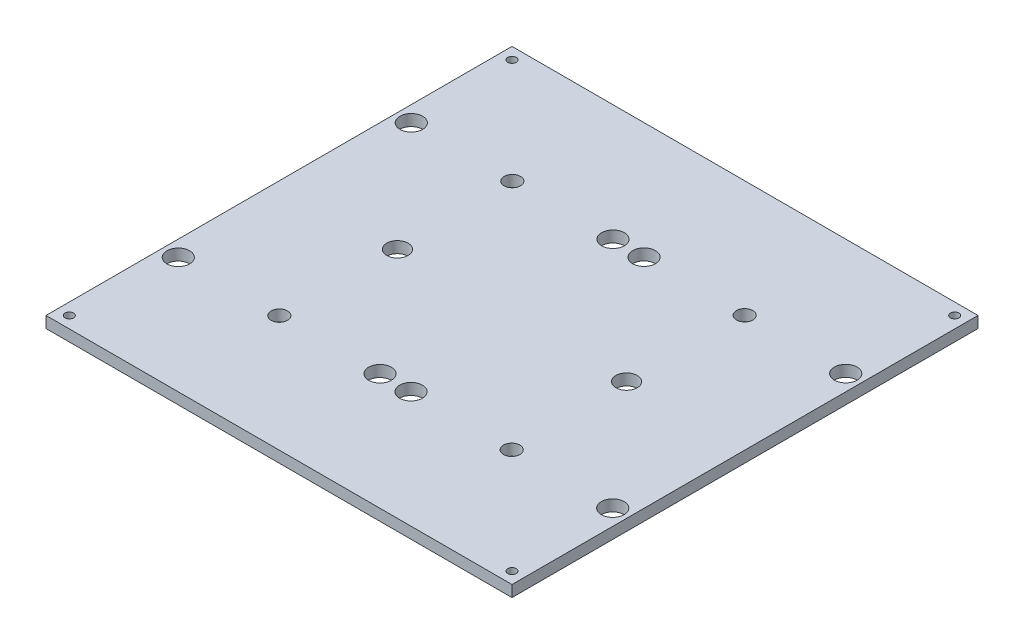
ISO-10303-21;
HEADER;
FILE_DESCRIPTION(('STEP AP214'),'2;1');
FILE_NAME('part.step','',(''),(''),'','','');
FILE_SCHEMA(('AUTOMOTIVE_DESIGN { 1 0 10303 214 1 1 1 1 }'));
ENDSEC;
DATA;
#1=APPLICATION_CONTEXT('core data for automotive mechanical design processes');
#2=APPLICATION_PROTOCOL_DEFINITION('international standard','automotive_design',2000,#1);
#3=PRODUCT_CONTEXT('',#1,'mechanical');
#4=PRODUCT('Part','Part','',(#3));
#5=PRODUCT_RELATED_PRODUCT_CATEGORY('part','',(#4));
#6=PRODUCT_DEFINITION_FORMATION('','',#4);
#7=PRODUCT_DEFINITION_CONTEXT('part definition',#1,'design');
#8=PRODUCT_DEFINITION('design','',#6,#7);
#9=PRODUCT_DEFINITION_SHAPE('','',#8);
#10=(LENGTH_UNIT() NAMED_UNIT(*) SI_UNIT(.MILLI.,.METRE.));
#11=(NAMED_UNIT(*) PLANE_ANGLE_UNIT() SI_UNIT($,.RADIAN.));
#12=(NAMED_UNIT(*) SI_UNIT($,.STERADIAN.) SOLID_ANGLE_UNIT());
#13=UNCERTAINTY_MEASURE_WITH_UNIT(LENGTH_MEASURE(1.E-05),#10,'distance_accuracy_value','');
#14=(GEOMETRIC_REPRESENTATION_CONTEXT(3) GLOBAL_UNCERTAINTY_ASSIGNED_CONTEXT((#13)) GLOBAL_UNIT_ASSIGNED_CONTEXT((#10,
#11,#12)) REPRESENTATION_CONTEXT('',''));
#15=CARTESIAN_POINT('',(0.,0.,0.));
#16=DIRECTION('',(0.,0.,1.));
#17=DIRECTION('',(1.,0.,0.));
#18=AXIS2_PLACEMENT_3D('',#15,#16,#17);
#19=CARTESIAN_POINT('',(0.,1.46,0.));
#20=DIRECTION('',(0.,-1.,0.));
#21=DIRECTION('',(0.,0.,-1.));
#22=AXIS2_PLACEMENT_3D('',#19,#20,#21);
#23=PLANE('',#22);
#24=DIRECTION('',(0.,0.,1.));
#25=VECTOR('',#24,1.);
#26=CARTESIAN_POINT('',(-30.,1.46,-30.));
#27=LINE('',#26,#25);
#28=CARTESIAN_POINT('',(-30.,1.46,-30.));
#29=VERTEX_POINT('',#28);
#30=CARTESIAN_POINT('',(-30.,1.46,30.));
#31=VERTEX_POINT('',#30);
#32=EDGE_CURVE('E85',#29,#31,#27,.T.);
#33=ORIENTED_EDGE('',*,*,#32,.T.);
#34=DIRECTION('',(1.,0.,0.));
#35=VECTOR('',#34,1.);
#36=CARTESIAN_POINT('',(30.,1.46,30.));
#37=LINE('',#36,#35);
#38=CARTESIAN_POINT('',(30.,1.46,30.));
#39=VERTEX_POINT('',#38);
#40=EDGE_CURVE('E80',#31,#39,#37,.T.);
#41=ORIENTED_EDGE('',*,*,#40,.T.);
#42=DIRECTION('',(0.,0.,-1.));
#43=VECTOR('',#42,1.);
#44=CARTESIAN_POINT('',(30.,1.46,-30.));
#45=LINE('',#44,#43);
#46=CARTESIAN_POINT('',(30.,1.46,-30.));
#47=VERTEX_POINT('',#46);
#48=EDGE_CURVE('E83',#39,#47,#45,.T.);
#49=ORIENTED_EDGE('',*,*,#48,.T.);
#50=DIRECTION('',(-1.,0.,0.));
#51=VECTOR('',#50,1.);
#52=CARTESIAN_POINT('',(30.,1.46,-30.));
#53=LINE('',#52,#51);
#54=EDGE_CURVE('E50',#47,#29,#53,.T.);
#55=ORIENTED_EDGE('',*,*,#54,.T.);
#56=EDGE_LOOP('',(#33,#41,#49,#55));
#57=FACE_BOUND('',#56,.T.);
#58=CARTESIAN_POINT('',(-14.75,1.46,0.));
#59=DIRECTION('',(0.,1.,0.));
#60=DIRECTION('',(0.,0.,1.));
#61=AXIS2_PLACEMENT_3D('',#58,#59,#60);
#62=CIRCLE('',#61,1.375);
#63=CARTESIAN_POINT('',(-14.75,1.46,1.375));
#64=VERTEX_POINT('',#63);
#65=EDGE_CURVE('E100',#64,#64,#62,.T.);
#66=ORIENTED_EDGE('',*,*,#65,.F.);
#67=EDGE_LOOP('',(#66));
#68=FACE_BOUND('',#67,.T.);
#69=CARTESIAN_POINT('',(-28.5,1.46,-28.5));
#70=DIRECTION('',(0.,1.,0.));
#71=DIRECTION('',(0.,0.,1.));
#72=AXIS2_PLACEMENT_3D('',#69,#70,#71);
#73=CIRCLE('',#72,0.550000000000003);
#74=CARTESIAN_POINT('',(-28.5,1.46,-27.95));
#75=VERTEX_POINT('',#74);
#76=EDGE_CURVE('E115',#75,#75,#73,.T.);
#77=ORIENTED_EDGE('',*,*,#76,.F.);
#78=EDGE_LOOP('',(#77));
#79=FACE_BOUND('',#78,.T.);
#80=CARTESIAN_POINT('',(-27.968,1.46,-15.));
#81=DIRECTION('',(0.,1.,0.));
#82=DIRECTION('',(0.,0.,1.));
#83=AXIS2_PLACEMENT_3D('',#80,#81,#82);
#84=CIRCLE('',#83,1.465);
#85=CARTESIAN_POINT('',(-27.968,1.46,-13.535));
#86=VERTEX_POINT('',#85);
#87=EDGE_CURVE('E121',#86,#86,#84,.T.);
#88=ORIENTED_EDGE('',*,*,#87,.F.);
#89=EDGE_LOOP('',(#88));
#90=FACE_BOUND('',#89,.T.);
#91=CARTESIAN_POINT('',(2.,1.46,-15.));
#92=DIRECTION('',(0.,1.,0.));
#93=DIRECTION('',(0.,0.,-1.));
#94=AXIS2_PLACEMENT_3D('',#91,#92,#93);
#95=CIRCLE('',#94,1.465);
#96=CARTESIAN_POINT('',(2.,1.46,-16.465));
#97=VERTEX_POINT('',#96);
#98=EDGE_CURVE('E127',#97,#97,#95,.T.);
#99=ORIENTED_EDGE('',*,*,#98,.F.);
#100=EDGE_LOOP('',(#99));
#101=FACE_BOUND('',#100,.T.);
#102=CARTESIAN_POINT('',(-14.960000108,1.46,-15.));
#103=DIRECTION('',(0.,1.,0.));
#104=DIRECTION('',(0.,0.,1.));
#105=AXIS2_PLACEMENT_3D('',#102,#103,#104);
#106=CIRCLE('',#105,1.055);
#107=CARTESIAN_POINT('',(-14.960000108,1.46,-13.945));
#108=VERTEX_POINT('',#107);
#109=EDGE_CURVE('E133',#108,#108,#106,.T.);
#110=ORIENTED_EDGE('',*,*,#109,.F.);
#111=EDGE_LOOP('',(#110));
#112=FACE_BOUND('',#111,.T.);
#113=CARTESIAN_POINT('',(-2.,1.46,-15.));
#114=DIRECTION('',(0.,1.,0.));
#115=DIRECTION('',(0.,0.,1.));
#116=AXIS2_PLACEMENT_3D('',#113,#114,#115);
#117=CIRCLE('',#116,1.465);
#118=CARTESIAN_POINT('',(-2.,1.46,-13.535));
#119=VERTEX_POINT('',#118);
#120=EDGE_CURVE('E139',#119,#119,#117,.T.);
#121=ORIENTED_EDGE('',*,*,#120,.F.);
#122=EDGE_LOOP('',(#121));
#123=FACE_BOUND('',#122,.T.);
#124=CARTESIAN_POINT('',(14.960000108,1.46,-15.));
#125=DIRECTION('',(0.,1.,0.));
#126=DIRECTION('',(0.,0.,-1.));
#127=AXIS2_PLACEMENT_3D('',#124,#125,#126);
#128=CIRCLE('',#127,1.055);
#129=CARTESIAN_POINT('',(14.960000108,1.46,-16.055));
#130=VERTEX_POINT('',#129);
#131=EDGE_CURVE('E145',#130,#130,#128,.T.);
#132=ORIENTED_EDGE('',*,*,#131,.F.);
#133=EDGE_LOOP('',(#132));
#134=FACE_BOUND('',#133,.T.);
#135=CARTESIAN_POINT('',(14.75,1.46,0.));
#136=DIRECTION('',(0.,1.,0.));
#137=DIRECTION('',(0.,0.,-1.));
#138=AXIS2_PLACEMENT_3D('',#135,#136,#137);
#139=CIRCLE('',#138,1.375);
#140=CARTESIAN_POINT('',(14.75,1.46,-1.37500000000001));
#141=VERTEX_POINT('',#140);
#142=EDGE_CURVE('E151',#141,#141,#139,.T.);
#143=ORIENTED_EDGE('',*,*,#142,.F.);
#144=EDGE_LOOP('',(#143));
#145=FACE_BOUND('',#144,.T.);
#146=CARTESIAN_POINT('',(27.968,1.46,-15.));
#147=DIRECTION('',(0.,1.,0.));
#148=DIRECTION('',(0.,0.,-1.));
#149=AXIS2_PLACEMENT_3D('',#146,#147,#148);
#150=CIRCLE('',#149,1.465);
#151=CARTESIAN_POINT('',(27.968,1.46,-16.465));
#152=VERTEX_POINT('',#151);
#153=EDGE_CURVE('E157',#152,#152,#150,.T.);
#154=ORIENTED_EDGE('',*,*,#153,.F.);
#155=EDGE_LOOP('',(#154));
#156=FACE_BOUND('',#155,.T.);
#157=CARTESIAN_POINT('',(28.5,1.46,-28.5));
#158=DIRECTION('',(0.,1.,0.));
#159=DIRECTION('',(0.,0.,-1.));
#160=AXIS2_PLACEMENT_3D('',#157,#158,#159);
#161=CIRCLE('',#160,0.550000000000003);
#162=CARTESIAN_POINT('',(28.5,1.46,-29.05));
#163=VERTEX_POINT('',#162);
#164=EDGE_CURVE('E163',#163,#163,#161,.T.);
#165=ORIENTED_EDGE('',*,*,#164,.F.);
#166=EDGE_LOOP('',(#165));
#167=FACE_BOUND('',#166,.T.);
#168=CARTESIAN_POINT('',(28.5,1.46,28.5));
#169=DIRECTION('',(0.,1.,0.));
#170=DIRECTION('',(0.,0.,1.));
#171=AXIS2_PLACEMENT_3D('',#168,#169,#170);
#172=CIRCLE('',#171,0.550000000000003);
#173=CARTESIAN_POINT('',(28.5,1.46,29.05));
#174=VERTEX_POINT('',#173);
#175=EDGE_CURVE('E169',#174,#174,#172,.T.);
#176=ORIENTED_EDGE('',*,*,#175,.F.);
#177=EDGE_LOOP('',(#176));
#178=FACE_BOUND('',#177,.T.);
#179=CARTESIAN_POINT('',(27.968,1.46,15.));
#180=DIRECTION('',(0.,1.,0.));
#181=DIRECTION('',(0.,0.,1.));
#182=AXIS2_PLACEMENT_3D('',#179,#180,#181);
#183=CIRCLE('',#182,1.465);
#184=CARTESIAN_POINT('',(27.968,1.46,16.465));
#185=VERTEX_POINT('',#184);
#186=EDGE_CURVE('E175',#185,#185,#183,.T.);
#187=ORIENTED_EDGE('',*,*,#186,.F.);
#188=EDGE_LOOP('',(#187));
#189=FACE_BOUND('',#188,.T.);
#190=CARTESIAN_POINT('',(14.960000108,1.46,15.));
#191=DIRECTION('',(0.,1.,0.));
#192=DIRECTION('',(0.,0.,1.));
#193=AXIS2_PLACEMENT_3D('',#190,#191,#192);
#194=CIRCLE('',#193,1.055);
#195=CARTESIAN_POINT('',(14.960000108,1.46,16.055));
#196=VERTEX_POINT('',#195);
#197=EDGE_CURVE('E181',#196,#196,#194,.T.);
#198=ORIENTED_EDGE('',*,*,#197,.F.);
#199=EDGE_LOOP('',(#198));
#200=FACE_BOUND('',#199,.T.);
#201=CARTESIAN_POINT('',(1.99999999999997,1.46,15.));
#202=DIRECTION('',(0.,1.,0.));
#203=DIRECTION('',(0.,0.,1.));
#204=AXIS2_PLACEMENT_3D('',#201,#202,#203);
#205=CIRCLE('',#204,1.46499999999998);
#206=CARTESIAN_POINT('',(1.99999999999997,1.46,16.465));
#207=VERTEX_POINT('',#206);
#208=EDGE_CURVE('E187',#207,#207,#205,.T.);
#209=ORIENTED_EDGE('',*,*,#208,.F.);
#210=EDGE_LOOP('',(#209));
#211=FACE_BOUND('',#210,.T.);
#212=CARTESIAN_POINT('',(-2.00000000000002,1.46,15.));
#213=DIRECTION('',(0.,1.,0.));
#214=DIRECTION('',(0.,0.,-1.));
#215=AXIS2_PLACEMENT_3D('',#212,#213,#214);
#216=CIRCLE('',#215,1.46500000000001);
#217=CARTESIAN_POINT('',(-2.00000000000002,1.46,13.535));
#218=VERTEX_POINT('',#217);
#219=EDGE_CURVE('E193',#218,#218,#216,.T.);
#220=ORIENTED_EDGE('',*,*,#219,.F.);
#221=EDGE_LOOP('',(#220));
#222=FACE_BOUND('',#221,.T.);
#223=CARTESIAN_POINT('',(-14.960000108,1.46,15.));
#224=DIRECTION('',(0.,1.,0.));
#225=DIRECTION('',(0.,0.,-1.));
#226=AXIS2_PLACEMENT_3D('',#223,#224,#225);
#227=CIRCLE('',#226,1.055);
#228=CARTESIAN_POINT('',(-14.960000108,1.46,13.945));
#229=VERTEX_POINT('',#228);
#230=EDGE_CURVE('E199',#229,#229,#227,.T.);
#231=ORIENTED_EDGE('',*,*,#230,.F.);
#232=EDGE_LOOP('',(#231));
#233=FACE_BOUND('',#232,.T.);
#234=CARTESIAN_POINT('',(-27.968,1.46,15.));
#235=DIRECTION('',(0.,1.,0.));
#236=DIRECTION('',(0.,0.,-1.));
#237=AXIS2_PLACEMENT_3D('',#234,#235,#236);
#238=CIRCLE('',#237,1.465);
#239=CARTESIAN_POINT('',(-27.968,1.46,13.535));
#240=VERTEX_POINT('',#239);
#241=EDGE_CURVE('E205',#240,#240,#238,.T.);
#242=ORIENTED_EDGE('',*,*,#241,.F.);
#243=EDGE_LOOP('',(#242));
#244=FACE_BOUND('',#243,.T.);
#245=CARTESIAN_POINT('',(-28.5,1.46,28.5));
#246=DIRECTION('',(0.,1.,0.));
#247=DIRECTION('',(0.,0.,-1.));
#248=AXIS2_PLACEMENT_3D('',#245,#246,#247);
#249=CIRCLE('',#248,0.550000000000003);
#250=CARTESIAN_POINT('',(-28.5,1.46,27.95));
#251=VERTEX_POINT('',#250);
#252=EDGE_CURVE('E211',#251,#251,#249,.T.);
#253=ORIENTED_EDGE('',*,*,#252,.F.);
#254=EDGE_LOOP('',(#253));
#255=FACE_BOUND('',#254,.T.);
#256=ADVANCED_FACE('F33',(#57,#68,#79,#90,#101,#112,#123,#134,#145,#156,#167,#178,#189,#200,
#211,#222,#233,#244,#255),#23,.F.);
#257=CARTESIAN_POINT('',(0.,0.,0.));
#258=DIRECTION('',(0.,-1.,0.));
#259=DIRECTION('',(0.,0.,-1.));
#260=AXIS2_PLACEMENT_3D('',#257,#258,#259);
#261=PLANE('',#260);
#262=CARTESIAN_POINT('',(-27.968,0.,15.));
#263=DIRECTION('',(0.,1.,0.));
#264=DIRECTION('',(0.,0.,-1.));
#265=AXIS2_PLACEMENT_3D('',#262,#263,#264);
#266=CIRCLE('',#265,1.465);
#267=CARTESIAN_POINT('',(-27.968,0.,13.535));
#268=VERTEX_POINT('',#267);
#269=EDGE_CURVE('E208',#268,#268,#266,.T.);
#270=ORIENTED_EDGE('',*,*,#269,.T.);
#271=EDGE_LOOP('',(#270));
#272=FACE_BOUND('',#271,.T.);
#273=CARTESIAN_POINT('',(-2.00000000000002,0.,15.));
#274=DIRECTION('',(0.,1.,0.));
#275=DIRECTION('',(0.,0.,-1.));
#276=AXIS2_PLACEMENT_3D('',#273,#274,#275);
#277=CIRCLE('',#276,1.46500000000001);
#278=CARTESIAN_POINT('',(-2.00000000000002,0.,13.535));
#279=VERTEX_POINT('',#278);
#280=EDGE_CURVE('E196',#279,#279,#277,.T.);
#281=ORIENTED_EDGE('',*,*,#280,.T.);
#282=EDGE_LOOP('',(#281));
#283=FACE_BOUND('',#282,.T.);
#284=CARTESIAN_POINT('',(14.960000108,0.,15.));
#285=DIRECTION('',(0.,1.,0.));
#286=DIRECTION('',(0.,0.,1.));
#287=AXIS2_PLACEMENT_3D('',#284,#285,#286);
#288=CIRCLE('',#287,1.055);
#289=CARTESIAN_POINT('',(14.960000108,0.,16.055));
#290=VERTEX_POINT('',#289);
#291=EDGE_CURVE('E184',#290,#290,#288,.T.);
#292=ORIENTED_EDGE('',*,*,#291,.T.);
#293=EDGE_LOOP('',(#292));
#294=FACE_BOUND('',#293,.T.);
#295=CARTESIAN_POINT('',(28.5,0.,28.5));
#296=DIRECTION('',(0.,1.,0.));
#297=DIRECTION('',(0.,0.,1.));
#298=AXIS2_PLACEMENT_3D('',#295,#296,#297);
#299=CIRCLE('',#298,0.550000000000003);
#300=CARTESIAN_POINT('',(28.5,0.,29.05));
#301=VERTEX_POINT('',#300);
#302=EDGE_CURVE('E172',#301,#301,#299,.T.);
#303=ORIENTED_EDGE('',*,*,#302,.T.);
#304=EDGE_LOOP('',(#303));
#305=FACE_BOUND('',#304,.T.);
#306=CARTESIAN_POINT('',(27.968,0.,-15.));
#307=DIRECTION('',(0.,1.,0.));
#308=DIRECTION('',(0.,0.,-1.));
#309=AXIS2_PLACEMENT_3D('',#306,#307,#308);
#310=CIRCLE('',#309,1.465);
#311=CARTESIAN_POINT('',(27.968,0.,-16.465));
#312=VERTEX_POINT('',#311);
#313=EDGE_CURVE('E160',#312,#312,#310,.T.);
#314=ORIENTED_EDGE('',*,*,#313,.T.);
#315=EDGE_LOOP('',(#314));
#316=FACE_BOUND('',#315,.T.);
#317=CARTESIAN_POINT('',(14.960000108,0.,-15.));
#318=DIRECTION('',(0.,1.,0.));
#319=DIRECTION('',(0.,0.,-1.));
#320=AXIS2_PLACEMENT_3D('',#317,#318,#319);
#321=CIRCLE('',#320,1.055);
#322=CARTESIAN_POINT('',(14.960000108,0.,-16.055));
#323=VERTEX_POINT('',#322);
#324=EDGE_CURVE('E148',#323,#323,#321,.T.);
#325=ORIENTED_EDGE('',*,*,#324,.T.);
#326=EDGE_LOOP('',(#325));
#327=FACE_BOUND('',#326,.T.);
#328=CARTESIAN_POINT('',(-14.960000108,0.,-15.));
#329=DIRECTION('',(0.,1.,0.));
#330=DIRECTION('',(0.,0.,1.));
#331=AXIS2_PLACEMENT_3D('',#328,#329,#330);
#332=CIRCLE('',#331,1.055);
#333=CARTESIAN_POINT('',(-14.960000108,0.,-13.945));
#334=VERTEX_POINT('',#333);
#335=EDGE_CURVE('E136',#334,#334,#332,.T.);
#336=ORIENTED_EDGE('',*,*,#335,.T.);
#337=EDGE_LOOP('',(#336));
#338=FACE_BOUND('',#337,.T.);
#339=CARTESIAN_POINT('',(-27.968,0.,-15.));
#340=DIRECTION('',(0.,1.,0.));
#341=DIRECTION('',(0.,0.,1.));
#342=AXIS2_PLACEMENT_3D('',#339,#340,#341);
#343=CIRCLE('',#342,1.465);
#344=CARTESIAN_POINT('',(-27.968,0.,-13.535));
#345=VERTEX_POINT('',#344);
#346=EDGE_CURVE('E124',#345,#345,#343,.T.);
#347=ORIENTED_EDGE('',*,*,#346,.T.);
#348=EDGE_LOOP('',(#347));
#349=FACE_BOUND('',#348,.T.);
#350=CARTESIAN_POINT('',(-14.75,0.,0.));
#351=DIRECTION('',(0.,1.,0.));
#352=DIRECTION('',(0.,0.,1.));
#353=AXIS2_PLACEMENT_3D('',#350,#351,#352);
#354=CIRCLE('',#353,1.375);
#355=CARTESIAN_POINT('',(-14.75,0.,1.375));
#356=VERTEX_POINT('',#355);
#357=EDGE_CURVE('E112',#356,#356,#354,.T.);
#358=ORIENTED_EDGE('',*,*,#357,.T.);
#359=EDGE_LOOP('',(#358));
#360=FACE_BOUND('',#359,.T.);
#361=DIRECTION('',(0.,0.,1.));
#362=VECTOR('',#361,1.);
#363=CARTESIAN_POINT('',(-30.,0.,-30.));
#364=LINE('',#363,#362);
#365=CARTESIAN_POINT('',(-30.,0.,-30.));
#366=VERTEX_POINT('',#365);
#367=CARTESIAN_POINT('',(-30.,0.,30.));
#368=VERTEX_POINT('',#367);
#369=EDGE_CURVE('E97',#366,#368,#364,.T.);
#370=ORIENTED_EDGE('',*,*,#369,.F.);
#371=DIRECTION('',(-1.,0.,0.));
#372=VECTOR('',#371,1.);
#373=CARTESIAN_POINT('',(30.,0.,-30.));
#374=LINE('',#373,#372);
#375=CARTESIAN_POINT('',(30.,0.,-30.));
#376=VERTEX_POINT('',#375);
#377=EDGE_CURVE('E73',#376,#366,#374,.T.);
#378=ORIENTED_EDGE('',*,*,#377,.F.);
#379=DIRECTION('',(0.,0.,-1.));
#380=VECTOR('',#379,1.);
#381=CARTESIAN_POINT('',(30.,0.,-30.));
#382=LINE('',#381,#380);
#383=CARTESIAN_POINT('',(30.,0.,30.));
#384=VERTEX_POINT('',#383);
#385=EDGE_CURVE('E67',#384,#376,#382,.T.);
#386=ORIENTED_EDGE('',*,*,#385,.F.);
#387=DIRECTION('',(1.,0.,0.));
#388=VECTOR('',#387,1.);
#389=CARTESIAN_POINT('',(30.,0.,30.));
#390=LINE('',#389,#388);
#391=EDGE_CURVE('E89',#368,#384,#390,.T.);
#392=ORIENTED_EDGE('',*,*,#391,.F.);
#393=EDGE_LOOP('',(#370,#378,#386,#392));
#394=FACE_BOUND('',#393,.T.);
#395=CARTESIAN_POINT('',(-28.5,0.,-28.5));
#396=DIRECTION('',(0.,1.,0.));
#397=DIRECTION('',(0.,0.,1.));
#398=AXIS2_PLACEMENT_3D('',#395,#396,#397);
#399=CIRCLE('',#398,0.550000000000003);
#400=CARTESIAN_POINT('',(-28.5,0.,-27.95));
#401=VERTEX_POINT('',#400);
#402=EDGE_CURVE('E118',#401,#401,#399,.T.);
#403=ORIENTED_EDGE('',*,*,#402,.T.);
#404=EDGE_LOOP('',(#403));
#405=FACE_BOUND('',#404,.T.);
#406=CARTESIAN_POINT('',(2.,0.,-15.));
#407=DIRECTION('',(0.,1.,0.));
#408=DIRECTION('',(0.,0.,-1.));
#409=AXIS2_PLACEMENT_3D('',#406,#407,#408);
#410=CIRCLE('',#409,1.465);
#411=CARTESIAN_POINT('',(2.,0.,-16.465));
#412=VERTEX_POINT('',#411);
#413=EDGE_CURVE('E130',#412,#412,#410,.T.);
#414=ORIENTED_EDGE('',*,*,#413,.T.);
#415=EDGE_LOOP('',(#414));
#416=FACE_BOUND('',#415,.T.);
#417=CARTESIAN_POINT('',(-2.,0.,-15.));
#418=DIRECTION('',(0.,1.,0.));
#419=DIRECTION('',(0.,0.,1.));
#420=AXIS2_PLACEMENT_3D('',#417,#418,#419);
#421=CIRCLE('',#420,1.465);
#422=CARTESIAN_POINT('',(-2.,0.,-13.535));
#423=VERTEX_POINT('',#422);
#424=EDGE_CURVE('E142',#423,#423,#421,.T.);
#425=ORIENTED_EDGE('',*,*,#424,.T.);
#426=EDGE_LOOP('',(#425));
#427=FACE_BOUND('',#426,.T.);
#428=CARTESIAN_POINT('',(14.75,0.,0.));
#429=DIRECTION('',(0.,1.,0.));
#430=DIRECTION('',(0.,0.,-1.));
#431=AXIS2_PLACEMENT_3D('',#428,#429,#430);
#432=CIRCLE('',#431,1.375);
#433=CARTESIAN_POINT('',(14.75,0.,-1.37500000000001));
#434=VERTEX_POINT('',#433);
#435=EDGE_CURVE('E154',#434,#434,#432,.T.);
#436=ORIENTED_EDGE('',*,*,#435,.T.);
#437=EDGE_LOOP('',(#436));
#438=FACE_BOUND('',#437,.T.);
#439=CARTESIAN_POINT('',(28.5,0.,-28.5));
#440=DIRECTION('',(0.,1.,0.));
#441=DIRECTION('',(0.,0.,-1.));
#442=AXIS2_PLACEMENT_3D('',#439,#440,#441);
#443=CIRCLE('',#442,0.550000000000003);
#444=CARTESIAN_POINT('',(28.5,0.,-29.05));
#445=VERTEX_POINT('',#444);
#446=EDGE_CURVE('E166',#445,#445,#443,.T.);
#447=ORIENTED_EDGE('',*,*,#446,.T.);
#448=EDGE_LOOP('',(#447));
#449=FACE_BOUND('',#448,.T.);
#450=CARTESIAN_POINT('',(27.968,0.,15.));
#451=DIRECTION('',(0.,1.,0.));
#452=DIRECTION('',(0.,0.,1.));
#453=AXIS2_PLACEMENT_3D('',#450,#451,#452);
#454=CIRCLE('',#453,1.465);
#455=CARTESIAN_POINT('',(27.968,0.,16.465));
#456=VERTEX_POINT('',#455);
#457=EDGE_CURVE('E178',#456,#456,#454,.T.);
#458=ORIENTED_EDGE('',*,*,#457,.T.);
#459=EDGE_LOOP('',(#458));
#460=FACE_BOUND('',#459,.T.);
#461=CARTESIAN_POINT('',(1.99999999999997,0.,15.));
#462=DIRECTION('',(0.,1.,0.));
#463=DIRECTION('',(0.,0.,1.));
#464=AXIS2_PLACEMENT_3D('',#461,#462,#463);
#465=CIRCLE('',#464,1.46499999999998);
#466=CARTESIAN_POINT('',(1.99999999999997,0.,16.465));
#467=VERTEX_POINT('',#466);
#468=EDGE_CURVE('E190',#467,#467,#465,.T.);
#469=ORIENTED_EDGE('',*,*,#468,.T.);
#470=EDGE_LOOP('',(#469));
#471=FACE_BOUND('',#470,.T.);
#472=CARTESIAN_POINT('',(-14.960000108,0.,15.));
#473=DIRECTION('',(0.,1.,0.));
#474=DIRECTION('',(0.,0.,-1.));
#475=AXIS2_PLACEMENT_3D('',#472,#473,#474);
#476=CIRCLE('',#475,1.055);
#477=CARTESIAN_POINT('',(-14.960000108,0.,13.945));
#478=VERTEX_POINT('',#477);
#479=EDGE_CURVE('E202',#478,#478,#476,.T.);
#480=ORIENTED_EDGE('',*,*,#479,.T.);
#481=EDGE_LOOP('',(#480));
#482=FACE_BOUND('',#481,.T.);
#483=CARTESIAN_POINT('',(-28.5,0.,28.5));
#484=DIRECTION('',(0.,1.,0.));
#485=DIRECTION('',(0.,0.,-1.));
#486=AXIS2_PLACEMENT_3D('',#483,#484,#485);
#487=CIRCLE('',#486,0.550000000000003);
#488=CARTESIAN_POINT('',(-28.5,0.,27.95));
#489=VERTEX_POINT('',#488);
#490=EDGE_CURVE('E214',#489,#489,#487,.T.);
#491=ORIENTED_EDGE('',*,*,#490,.T.);
#492=EDGE_LOOP('',(#491));
#493=FACE_BOUND('',#492,.T.);
#494=ADVANCED_FACE('F108',(#272,#283,#294,#305,#316,#327,#338,#349,#360,#394,#405,#416,#427,
#438,#449,#460,#471,#482,#493),#261,.T.);
#495=CARTESIAN_POINT('',(-30.,1.46,-30.));
#496=DIRECTION('',(1.,0.,0.));
#497=DIRECTION('',(0.,0.,-1.));
#498=AXIS2_PLACEMENT_3D('',#495,#496,#497);
#499=PLANE('',#498);
#500=ORIENTED_EDGE('',*,*,#369,.T.);
#501=DIRECTION('',(0.,-1.,0.));
#502=VECTOR('',#501,1.);
#503=CARTESIAN_POINT('',(-30.,1.46,30.));
#504=LINE('',#503,#502);
#505=EDGE_CURVE('E11',#31,#368,#504,.T.);
#506=ORIENTED_EDGE('',*,*,#505,.F.);
#507=ORIENTED_EDGE('',*,*,#32,.F.);
#508=DIRECTION('',(0.,-1.,0.));
#509=VECTOR('',#508,1.);
#510=CARTESIAN_POINT('',(-30.,1.46,-30.));
#511=LINE('',#510,#509);
#512=EDGE_CURVE('E93',#29,#366,#511,.T.);
#513=ORIENTED_EDGE('',*,*,#512,.T.);
#514=EDGE_LOOP('',(#500,#506,#507,#513));
#515=FACE_BOUND('',#514,.T.);
#516=ADVANCED_FACE('F35',(#515),#499,.F.);
#517=CARTESIAN_POINT('',(30.,1.46,30.));
#518=DIRECTION('',(0.,0.,-1.));
#519=DIRECTION('',(-1.,0.,0.));
#520=AXIS2_PLACEMENT_3D('',#517,#518,#519);
#521=PLANE('',#520);
#522=ORIENTED_EDGE('',*,*,#391,.T.);
#523=DIRECTION('',(0.,-1.,0.));
#524=VECTOR('',#523,1.);
#525=CARTESIAN_POINT('',(30.,1.46,30.));
#526=LINE('',#525,#524);
#527=EDGE_CURVE('E42',#39,#384,#526,.T.);
#528=ORIENTED_EDGE('',*,*,#527,.F.);
#529=ORIENTED_EDGE('',*,*,#40,.F.);
#530=ORIENTED_EDGE('',*,*,#505,.T.);
#531=EDGE_LOOP('',(#522,#528,#529,#530));
#532=FACE_BOUND('',#531,.T.);
#533=ADVANCED_FACE('F88',(#532),#521,.F.);
#534=CARTESIAN_POINT('',(30.,1.46,-30.));
#535=DIRECTION('',(-1.,0.,0.));
#536=DIRECTION('',(0.,0.,1.));
#537=AXIS2_PLACEMENT_3D('',#534,#535,#536);
#538=PLANE('',#537);
#539=ORIENTED_EDGE('',*,*,#385,.T.);
#540=DIRECTION('',(0.,-1.,0.));
#541=VECTOR('',#540,1.);
#542=CARTESIAN_POINT('',(30.,1.46,-30.));
#543=LINE('',#542,#541);
#544=EDGE_CURVE('E90',#47,#376,#543,.T.);
#545=ORIENTED_EDGE('',*,*,#544,.F.);
#546=ORIENTED_EDGE('',*,*,#48,.F.);
#547=ORIENTED_EDGE('',*,*,#527,.T.);
#548=EDGE_LOOP('',(#539,#545,#546,#547));
#549=FACE_BOUND('',#548,.T.);
#550=ADVANCED_FACE('F91',(#549),#538,.F.);
#551=CARTESIAN_POINT('',(30.,1.46,-30.));
#552=DIRECTION('',(0.,0.,1.));
#553=DIRECTION('',(1.,0.,0.));
#554=AXIS2_PLACEMENT_3D('',#551,#552,#553);
#555=PLANE('',#554);
#556=ORIENTED_EDGE('',*,*,#377,.T.);
#557=ORIENTED_EDGE('',*,*,#512,.F.);
#558=ORIENTED_EDGE('',*,*,#54,.F.);
#559=ORIENTED_EDGE('',*,*,#544,.T.);
#560=EDGE_LOOP('',(#556,#557,#558,#559));
#561=FACE_BOUND('',#560,.T.);
#562=ADVANCED_FACE('F105',(#561),#555,.F.);
#563=CARTESIAN_POINT('',(-14.75,1.46,0.));
#564=DIRECTION('',(0.,-1.,0.));
#565=DIRECTION('',(0.,0.,-1.));
#566=AXIS2_PLACEMENT_3D('',#563,#564,#565);
#567=CYLINDRICAL_SURFACE('',#566,1.375);
#568=ORIENTED_EDGE('',*,*,#65,.T.);
#569=EDGE_LOOP('',(#568));
#570=FACE_BOUND('',#569,.T.);
#571=ORIENTED_EDGE('',*,*,#357,.F.);
#572=EDGE_LOOP('',(#571));
#573=FACE_BOUND('',#572,.T.);
#574=ADVANCED_FACE('F231',(#570,#573),#567,.F.);
#575=CARTESIAN_POINT('',(-28.5,1.46,-28.5));
#576=DIRECTION('',(0.,-1.,0.));
#577=DIRECTION('',(0.,0.,-1.));
#578=AXIS2_PLACEMENT_3D('',#575,#576,#577);
#579=CYLINDRICAL_SURFACE('',#578,0.550000000000003);
#580=ORIENTED_EDGE('',*,*,#76,.T.);
#581=EDGE_LOOP('',(#580));
#582=FACE_BOUND('',#581,.T.);
#583=ORIENTED_EDGE('',*,*,#402,.F.);
#584=EDGE_LOOP('',(#583));
#585=FACE_BOUND('',#584,.T.);
#586=ADVANCED_FACE('F277',(#582,#585),#579,.F.);
#587=CARTESIAN_POINT('',(-27.968,1.46,-15.));
#588=DIRECTION('',(0.,-1.,0.));
#589=DIRECTION('',(0.,0.,-1.));
#590=AXIS2_PLACEMENT_3D('',#587,#588,#589);
#591=CYLINDRICAL_SURFACE('',#590,1.465);
#592=ORIENTED_EDGE('',*,*,#87,.T.);
#593=EDGE_LOOP('',(#592));
#594=FACE_BOUND('',#593,.T.);
#595=ORIENTED_EDGE('',*,*,#346,.F.);
#596=EDGE_LOOP('',(#595));
#597=FACE_BOUND('',#596,.T.);
#598=ADVANCED_FACE('F285',(#594,#597),#591,.F.);
#599=CARTESIAN_POINT('',(2.,1.46,-15.));
#600=DIRECTION('',(0.,-1.,0.));
#601=DIRECTION('',(0.,0.,-1.));
#602=AXIS2_PLACEMENT_3D('',#599,#600,#601);
#603=CYLINDRICAL_SURFACE('',#602,1.465);
#604=ORIENTED_EDGE('',*,*,#98,.T.);
#605=EDGE_LOOP('',(#604));
#606=FACE_BOUND('',#605,.T.);
#607=ORIENTED_EDGE('',*,*,#413,.F.);
#608=EDGE_LOOP('',(#607));
#609=FACE_BOUND('',#608,.T.);
#610=ADVANCED_FACE('F293',(#606,#609),#603,.F.);
#611=CARTESIAN_POINT('',(-14.960000108,1.46,-15.));
#612=DIRECTION('',(0.,-1.,0.));
#613=DIRECTION('',(0.,0.,-1.));
#614=AXIS2_PLACEMENT_3D('',#611,#612,#613);
#615=CYLINDRICAL_SURFACE('',#614,1.055);
#616=ORIENTED_EDGE('',*,*,#109,.T.);
#617=EDGE_LOOP('',(#616));
#618=FACE_BOUND('',#617,.T.);
#619=ORIENTED_EDGE('',*,*,#335,.F.);
#620=EDGE_LOOP('',(#619));
#621=FACE_BOUND('',#620,.T.);
#622=ADVANCED_FACE('F302',(#618,#621),#615,.F.);
#623=CARTESIAN_POINT('',(-2.,1.46,-15.));
#624=DIRECTION('',(0.,-1.,0.));
#625=DIRECTION('',(0.,0.,-1.));
#626=AXIS2_PLACEMENT_3D('',#623,#624,#625);
#627=CYLINDRICAL_SURFACE('',#626,1.465);
#628=ORIENTED_EDGE('',*,*,#120,.T.);
#629=EDGE_LOOP('',(#628));
#630=FACE_BOUND('',#629,.T.);
#631=ORIENTED_EDGE('',*,*,#424,.F.);
#632=EDGE_LOOP('',(#631));
#633=FACE_BOUND('',#632,.T.);
#634=ADVANCED_FACE('F311',(#630,#633),#627,.F.);
#635=CARTESIAN_POINT('',(14.960000108,1.46,-15.));
#636=DIRECTION('',(0.,-1.,0.));
#637=DIRECTION('',(0.,0.,-1.));
#638=AXIS2_PLACEMENT_3D('',#635,#636,#637);
#639=CYLINDRICAL_SURFACE('',#638,1.055);
#640=ORIENTED_EDGE('',*,*,#131,.T.);
#641=EDGE_LOOP('',(#640));
#642=FACE_BOUND('',#641,.T.);
#643=ORIENTED_EDGE('',*,*,#324,.F.);
#644=EDGE_LOOP('',(#643));
#645=FACE_BOUND('',#644,.T.);
#646=ADVANCED_FACE('F320',(#642,#645),#639,.F.);
#647=CARTESIAN_POINT('',(14.75,1.46,0.));
#648=DIRECTION('',(0.,-1.,0.));
#649=DIRECTION('',(0.,0.,-1.));
#650=AXIS2_PLACEMENT_3D('',#647,#648,#649);
#651=CYLINDRICAL_SURFACE('',#650,1.375);
#652=ORIENTED_EDGE('',*,*,#142,.T.);
#653=EDGE_LOOP('',(#652));
#654=FACE_BOUND('',#653,.T.);
#655=ORIENTED_EDGE('',*,*,#435,.F.);
#656=EDGE_LOOP('',(#655));
#657=FACE_BOUND('',#656,.T.);
#658=ADVANCED_FACE('F329',(#654,#657),#651,.F.);
#659=CARTESIAN_POINT('',(27.968,1.46,-15.));
#660=DIRECTION('',(0.,-1.,0.));
#661=DIRECTION('',(0.,0.,-1.));
#662=AXIS2_PLACEMENT_3D('',#659,#660,#661);
#663=CYLINDRICAL_SURFACE('',#662,1.465);
#664=ORIENTED_EDGE('',*,*,#153,.T.);
#665=EDGE_LOOP('',(#664));
#666=FACE_BOUND('',#665,.T.);
#667=ORIENTED_EDGE('',*,*,#313,.F.);
#668=EDGE_LOOP('',(#667));
#669=FACE_BOUND('',#668,.T.);
#670=ADVANCED_FACE('F338',(#666,#669),#663,.F.);
#671=CARTESIAN_POINT('',(28.5,1.46,-28.5));
#672=DIRECTION('',(0.,-1.,0.));
#673=DIRECTION('',(0.,0.,-1.));
#674=AXIS2_PLACEMENT_3D('',#671,#672,#673);
#675=CYLINDRICAL_SURFACE('',#674,0.550000000000003);
#676=ORIENTED_EDGE('',*,*,#164,.T.);
#677=EDGE_LOOP('',(#676));
#678=FACE_BOUND('',#677,.T.);
#679=ORIENTED_EDGE('',*,*,#446,.F.);
#680=EDGE_LOOP('',(#679));
#681=FACE_BOUND('',#680,.T.);
#682=ADVANCED_FACE('F347',(#678,#681),#675,.F.);
#683=CARTESIAN_POINT('',(28.5,1.46,28.5));
#684=DIRECTION('',(0.,-1.,0.));
#685=DIRECTION('',(0.,0.,-1.));
#686=AXIS2_PLACEMENT_3D('',#683,#684,#685);
#687=CYLINDRICAL_SURFACE('',#686,0.550000000000003);
#688=ORIENTED_EDGE('',*,*,#175,.T.);
#689=EDGE_LOOP('',(#688));
#690=FACE_BOUND('',#689,.T.);
#691=ORIENTED_EDGE('',*,*,#302,.F.);
#692=EDGE_LOOP('',(#691));
#693=FACE_BOUND('',#692,.T.);
#694=ADVANCED_FACE('F356',(#690,#693),#687,.F.);
#695=CARTESIAN_POINT('',(27.968,1.46,15.));
#696=DIRECTION('',(0.,-1.,0.));
#697=DIRECTION('',(0.,0.,-1.));
#698=AXIS2_PLACEMENT_3D('',#695,#696,#697);
#699=CYLINDRICAL_SURFACE('',#698,1.465);
#700=ORIENTED_EDGE('',*,*,#186,.T.);
#701=EDGE_LOOP('',(#700));
#702=FACE_BOUND('',#701,.T.);
#703=ORIENTED_EDGE('',*,*,#457,.F.);
#704=EDGE_LOOP('',(#703));
#705=FACE_BOUND('',#704,.T.);
#706=ADVANCED_FACE('F365',(#702,#705),#699,.F.);
#707=CARTESIAN_POINT('',(14.960000108,1.46,15.));
#708=DIRECTION('',(0.,-1.,0.));
#709=DIRECTION('',(0.,0.,-1.));
#710=AXIS2_PLACEMENT_3D('',#707,#708,#709);
#711=CYLINDRICAL_SURFACE('',#710,1.055);
#712=ORIENTED_EDGE('',*,*,#197,.T.);
#713=EDGE_LOOP('',(#712));
#714=FACE_BOUND('',#713,.T.);
#715=ORIENTED_EDGE('',*,*,#291,.F.);
#716=EDGE_LOOP('',(#715));
#717=FACE_BOUND('',#716,.T.);
#718=ADVANCED_FACE('F374',(#714,#717),#711,.F.);
#719=CARTESIAN_POINT('',(1.99999999999997,1.46,15.));
#720=DIRECTION('',(0.,-1.,0.));
#721=DIRECTION('',(0.,0.,-1.));
#722=AXIS2_PLACEMENT_3D('',#719,#720,#721);
#723=CYLINDRICAL_SURFACE('',#722,1.46499999999998);
#724=ORIENTED_EDGE('',*,*,#208,.T.);
#725=EDGE_LOOP('',(#724));
#726=FACE_BOUND('',#725,.T.);
#727=ORIENTED_EDGE('',*,*,#468,.F.);
#728=EDGE_LOOP('',(#727));
#729=FACE_BOUND('',#728,.T.);
#730=ADVANCED_FACE('F383',(#726,#729),#723,.F.);
#731=CARTESIAN_POINT('',(-2.00000000000002,1.46,15.));
#732=DIRECTION('',(0.,-1.,0.));
#733=DIRECTION('',(0.,0.,-1.));
#734=AXIS2_PLACEMENT_3D('',#731,#732,#733);
#735=CYLINDRICAL_SURFACE('',#734,1.46500000000001);
#736=ORIENTED_EDGE('',*,*,#219,.T.);
#737=EDGE_LOOP('',(#736));
#738=FACE_BOUND('',#737,.T.);
#739=ORIENTED_EDGE('',*,*,#280,.F.);
#740=EDGE_LOOP('',(#739));
#741=FACE_BOUND('',#740,.T.);
#742=ADVANCED_FACE('F392',(#738,#741),#735,.F.);
#743=CARTESIAN_POINT('',(-14.960000108,1.46,15.));
#744=DIRECTION('',(0.,-1.,0.));
#745=DIRECTION('',(0.,0.,-1.));
#746=AXIS2_PLACEMENT_3D('',#743,#744,#745);
#747=CYLINDRICAL_SURFACE('',#746,1.055);
#748=ORIENTED_EDGE('',*,*,#230,.T.);
#749=EDGE_LOOP('',(#748));
#750=FACE_BOUND('',#749,.T.);
#751=ORIENTED_EDGE('',*,*,#479,.F.);
#752=EDGE_LOOP('',(#751));
#753=FACE_BOUND('',#752,.T.);
#754=ADVANCED_FACE('F401',(#750,#753),#747,.F.);
#755=CARTESIAN_POINT('',(-27.968,1.46,15.));
#756=DIRECTION('',(0.,-1.,0.));
#757=DIRECTION('',(0.,0.,-1.));
#758=AXIS2_PLACEMENT_3D('',#755,#756,#757);
#759=CYLINDRICAL_SURFACE('',#758,1.465);
#760=ORIENTED_EDGE('',*,*,#241,.T.);
#761=EDGE_LOOP('',(#760));
#762=FACE_BOUND('',#761,.T.);
#763=ORIENTED_EDGE('',*,*,#269,.F.);
#764=EDGE_LOOP('',(#763));
#765=FACE_BOUND('',#764,.T.);
#766=ADVANCED_FACE('F410',(#762,#765),#759,.F.);
#767=CARTESIAN_POINT('',(-28.5,1.46,28.5));
#768=DIRECTION('',(0.,-1.,0.));
#769=DIRECTION('',(0.,0.,-1.));
#770=AXIS2_PLACEMENT_3D('',#767,#768,#769);
#771=CYLINDRICAL_SURFACE('',#770,0.550000000000003);
#772=ORIENTED_EDGE('',*,*,#252,.T.);
#773=EDGE_LOOP('',(#772));
#774=FACE_BOUND('',#773,.T.);
#775=ORIENTED_EDGE('',*,*,#490,.F.);
#776=EDGE_LOOP('',(#775));
#777=FACE_BOUND('',#776,.T.);
#778=ADVANCED_FACE('F220',(#774,#777),#771,.F.);
#779=CLOSED_SHELL('',(#256,#494,#516,#533,#550,#562,#574,#586,#598,#610,#622,#634,#646,#658,
#670,#682,#694,#706,#718,#730,#742,#754,#766,#778));
#780=MANIFOLD_SOLID_BREP('B2',#779);
#781=ADVANCED_BREP_SHAPE_REPRESENTATION('',(#18,#780),#14);
#782=SHAPE_DEFINITION_REPRESENTATION(#9,#781);
ENDSEC;
END-ISO-10303-21;
